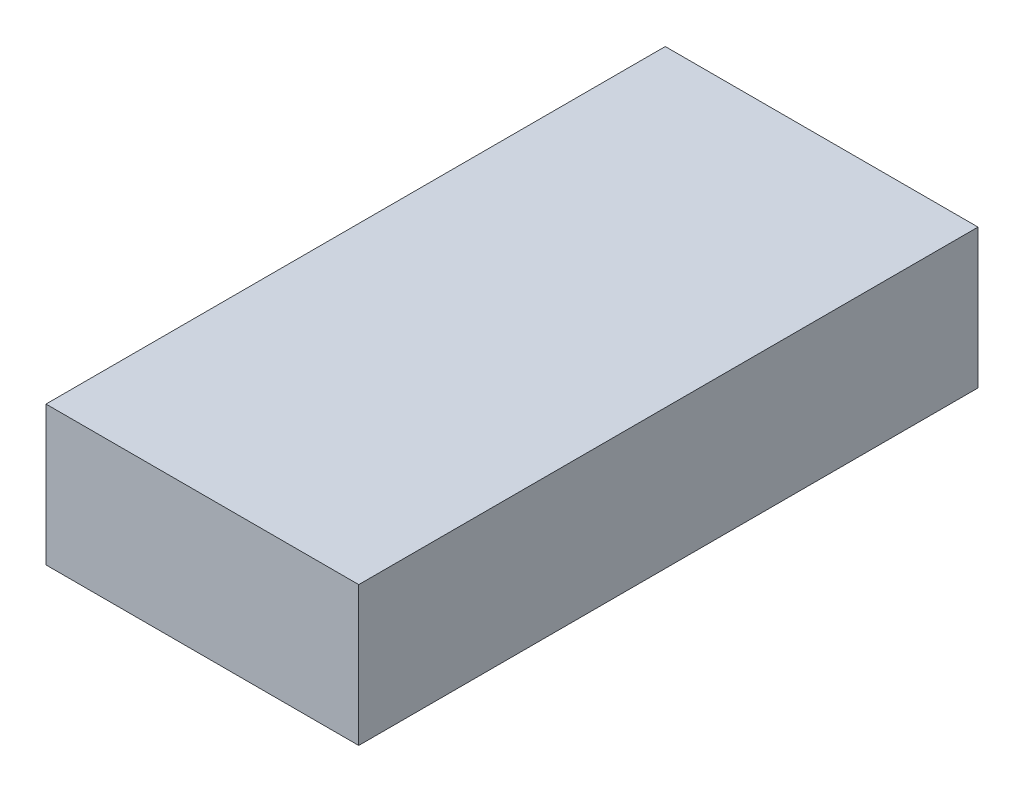
ISO-10303-21;
HEADER;
FILE_DESCRIPTION(('STEP AP214'),'2;1');
FILE_NAME('part.step','',(''),(''),'','','');
FILE_SCHEMA(('AUTOMOTIVE_DESIGN { 1 0 10303 214 1 1 1 1 }'));
ENDSEC;
DATA;
#1=APPLICATION_CONTEXT('core data for automotive mechanical design processes');
#2=APPLICATION_PROTOCOL_DEFINITION('international standard','automotive_design',2000,#1);
#3=PRODUCT_CONTEXT('',#1,'mechanical');
#4=PRODUCT('Part','Part','',(#3));
#5=PRODUCT_RELATED_PRODUCT_CATEGORY('part','',(#4));
#6=PRODUCT_DEFINITION_FORMATION('','',#4);
#7=PRODUCT_DEFINITION_CONTEXT('part definition',#1,'design');
#8=PRODUCT_DEFINITION('design','',#6,#7);
#9=PRODUCT_DEFINITION_SHAPE('','',#8);
#10=(LENGTH_UNIT() NAMED_UNIT(*) SI_UNIT(.MILLI.,.METRE.));
#11=(NAMED_UNIT(*) PLANE_ANGLE_UNIT() SI_UNIT($,.RADIAN.));
#12=(NAMED_UNIT(*) SI_UNIT($,.STERADIAN.) SOLID_ANGLE_UNIT());
#13=UNCERTAINTY_MEASURE_WITH_UNIT(LENGTH_MEASURE(1.E-05),#10,'distance_accuracy_value','');
#14=(GEOMETRIC_REPRESENTATION_CONTEXT(3) GLOBAL_UNCERTAINTY_ASSIGNED_CONTEXT((#13)) GLOBAL_UNIT_ASSIGNED_CONTEXT((#10,
#11,#12)) REPRESENTATION_CONTEXT('',''));
#15=CARTESIAN_POINT('',(0.,0.,0.));
#16=DIRECTION('',(0.,0.,1.));
#17=DIRECTION('',(1.,0.,0.));
#18=AXIS2_PLACEMENT_3D('',#15,#16,#17);
#19=CARTESIAN_POINT('',(10.1,9.,-20.));
#20=DIRECTION('',(-1.,0.,0.));
#21=DIRECTION('',(0.,0.,1.));
#22=AXIS2_PLACEMENT_3D('',#19,#20,#21);
#23=PLANE('',#22);
#24=DIRECTION('',(0.,0.,-1.));
#25=VECTOR('',#24,1.);
#26=CARTESIAN_POINT('',(10.1,0.,-20.));
#27=LINE('',#26,#25);
#28=CARTESIAN_POINT('',(10.1,0.,20.));
#29=VERTEX_POINT('',#28);
#30=CARTESIAN_POINT('',(10.1,0.,-20.));
#31=VERTEX_POINT('',#30);
#32=EDGE_CURVE('E98',#29,#31,#27,.T.);
#33=ORIENTED_EDGE('',*,*,#32,.T.);
#34=DIRECTION('',(0.,-1.,0.));
#35=VECTOR('',#34,1.);
#36=CARTESIAN_POINT('',(10.1,9.,-20.));
#37=LINE('',#36,#35);
#38=CARTESIAN_POINT('',(10.1,9.,-20.));
#39=VERTEX_POINT('',#38);
#40=EDGE_CURVE('E11',#39,#31,#37,.T.);
#41=ORIENTED_EDGE('',*,*,#40,.F.);
#42=DIRECTION('',(0.,0.,-1.));
#43=VECTOR('',#42,1.);
#44=CARTESIAN_POINT('',(10.1,9.,-20.));
#45=LINE('',#44,#43);
#46=CARTESIAN_POINT('',(10.1,9.,20.));
#47=VERTEX_POINT('',#46);
#48=EDGE_CURVE('E86',#47,#39,#45,.T.);
#49=ORIENTED_EDGE('',*,*,#48,.F.);
#50=DIRECTION('',(0.,-1.,0.));
#51=VECTOR('',#50,1.);
#52=CARTESIAN_POINT('',(10.1,9.,20.));
#53=LINE('',#52,#51);
#54=EDGE_CURVE('E94',#47,#29,#53,.T.);
#55=ORIENTED_EDGE('',*,*,#54,.T.);
#56=EDGE_LOOP('',(#33,#41,#49,#55));
#57=FACE_BOUND('',#56,.T.);
#58=ADVANCED_FACE('F35',(#57),#23,.F.);
#59=CARTESIAN_POINT('',(-10.1,9.,-20.));
#60=DIRECTION('',(0.,0.,1.));
#61=DIRECTION('',(1.,0.,0.));
#62=AXIS2_PLACEMENT_3D('',#59,#60,#61);
#63=PLANE('',#62);
#64=DIRECTION('',(-1.,0.,0.));
#65=VECTOR('',#64,1.);
#66=CARTESIAN_POINT('',(-10.1,0.,-20.));
#67=LINE('',#66,#65);
#68=CARTESIAN_POINT('',(-10.1,0.,-20.));
#69=VERTEX_POINT('',#68);
#70=EDGE_CURVE('E90',#31,#69,#67,.T.);
#71=ORIENTED_EDGE('',*,*,#70,.T.);
#72=DIRECTION('',(0.,-1.,0.));
#73=VECTOR('',#72,1.);
#74=CARTESIAN_POINT('',(-10.1,9.,-20.));
#75=LINE('',#74,#73);
#76=CARTESIAN_POINT('',(-10.1,9.,-20.));
#77=VERTEX_POINT('',#76);
#78=EDGE_CURVE('E43',#77,#69,#75,.T.);
#79=ORIENTED_EDGE('',*,*,#78,.F.);
#80=DIRECTION('',(-1.,0.,0.));
#81=VECTOR('',#80,1.);
#82=CARTESIAN_POINT('',(-10.1,9.,-20.));
#83=LINE('',#82,#81);
#84=EDGE_CURVE('E81',#39,#77,#83,.T.);
#85=ORIENTED_EDGE('',*,*,#84,.F.);
#86=ORIENTED_EDGE('',*,*,#40,.T.);
#87=EDGE_LOOP('',(#71,#79,#85,#86));
#88=FACE_BOUND('',#87,.T.);
#89=ADVANCED_FACE('F89',(#88),#63,.F.);
#90=CARTESIAN_POINT('',(-10.1,9.,-20.));
#91=DIRECTION('',(1.,0.,0.));
#92=DIRECTION('',(0.,0.,-1.));
#93=AXIS2_PLACEMENT_3D('',#90,#91,#92);
#94=PLANE('',#93);
#95=DIRECTION('',(0.,0.,1.));
#96=VECTOR('',#95,1.);
#97=CARTESIAN_POINT('',(-10.1,0.,-20.));
#98=LINE('',#97,#96);
#99=CARTESIAN_POINT('',(-10.1,0.,20.));
#100=VERTEX_POINT('',#99);
#101=EDGE_CURVE('E68',#69,#100,#98,.T.);
#102=ORIENTED_EDGE('',*,*,#101,.T.);
#103=DIRECTION('',(0.,-1.,0.));
#104=VECTOR('',#103,1.);
#105=CARTESIAN_POINT('',(-10.1,9.,20.));
#106=LINE('',#105,#104);
#107=CARTESIAN_POINT('',(-10.1,9.,20.));
#108=VERTEX_POINT('',#107);
#109=EDGE_CURVE('E91',#108,#100,#106,.T.);
#110=ORIENTED_EDGE('',*,*,#109,.F.);
#111=DIRECTION('',(0.,0.,1.));
#112=VECTOR('',#111,1.);
#113=CARTESIAN_POINT('',(-10.1,9.,-20.));
#114=LINE('',#113,#112);
#115=EDGE_CURVE('E84',#77,#108,#114,.T.);
#116=ORIENTED_EDGE('',*,*,#115,.F.);
#117=ORIENTED_EDGE('',*,*,#78,.T.);
#118=EDGE_LOOP('',(#102,#110,#116,#117));
#119=FACE_BOUND('',#118,.T.);
#120=ADVANCED_FACE('F92',(#119),#94,.F.);
#121=CARTESIAN_POINT('',(-10.1,9.,20.));
#122=DIRECTION('',(0.,0.,-1.));
#123=DIRECTION('',(-1.,0.,0.));
#124=AXIS2_PLACEMENT_3D('',#121,#122,#123);
#125=PLANE('',#124);
#126=DIRECTION('',(1.,0.,0.));
#127=VECTOR('',#126,1.);
#128=CARTESIAN_POINT('',(-10.1,0.,20.));
#129=LINE('',#128,#127);
#130=EDGE_CURVE('E74',#100,#29,#129,.T.);
#131=ORIENTED_EDGE('',*,*,#130,.T.);
#132=ORIENTED_EDGE('',*,*,#54,.F.);
#133=DIRECTION('',(1.,0.,0.));
#134=VECTOR('',#133,1.);
#135=CARTESIAN_POINT('',(-10.1,9.,20.));
#136=LINE('',#135,#134);
#137=EDGE_CURVE('E51',#108,#47,#136,.T.);
#138=ORIENTED_EDGE('',*,*,#137,.F.);
#139=ORIENTED_EDGE('',*,*,#109,.T.);
#140=EDGE_LOOP('',(#131,#132,#138,#139));
#141=FACE_BOUND('',#140,.T.);
#142=ADVANCED_FACE('F105',(#141),#125,.F.);
#143=CARTESIAN_POINT('',(0.,9.,0.));
#144=DIRECTION('',(0.,1.,0.));
#145=DIRECTION('',(0.,0.,1.));
#146=AXIS2_PLACEMENT_3D('',#143,#144,#145);
#147=PLANE('',#146);
#148=ORIENTED_EDGE('',*,*,#48,.T.);
#149=ORIENTED_EDGE('',*,*,#84,.T.);
#150=ORIENTED_EDGE('',*,*,#115,.T.);
#151=ORIENTED_EDGE('',*,*,#137,.T.);
#152=EDGE_LOOP('',(#148,#149,#150,#151));
#153=FACE_BOUND('',#152,.T.);
#154=ADVANCED_FACE('F82',(#153),#147,.T.);
#155=CARTESIAN_POINT('',(0.,0.,0.));
#156=DIRECTION('',(0.,1.,0.));
#157=DIRECTION('',(0.,0.,1.));
#158=AXIS2_PLACEMENT_3D('',#155,#156,#157);
#159=PLANE('',#158);
#160=ORIENTED_EDGE('',*,*,#32,.F.);
#161=ORIENTED_EDGE('',*,*,#130,.F.);
#162=ORIENTED_EDGE('',*,*,#101,.F.);
#163=ORIENTED_EDGE('',*,*,#70,.F.);
#164=EDGE_LOOP('',(#160,#161,#162,#163));
#165=FACE_BOUND('',#164,.T.);
#166=ADVANCED_FACE('F108',(#165),#159,.F.);
#167=CLOSED_SHELL('',(#58,#89,#120,#142,#154,#166));
#168=MANIFOLD_SOLID_BREP('B2',#167);
#169=ADVANCED_BREP_SHAPE_REPRESENTATION('',(#18,#168),#14);
#170=SHAPE_DEFINITION_REPRESENTATION(#9,#169);
ENDSEC;
END-ISO-10303-21;
